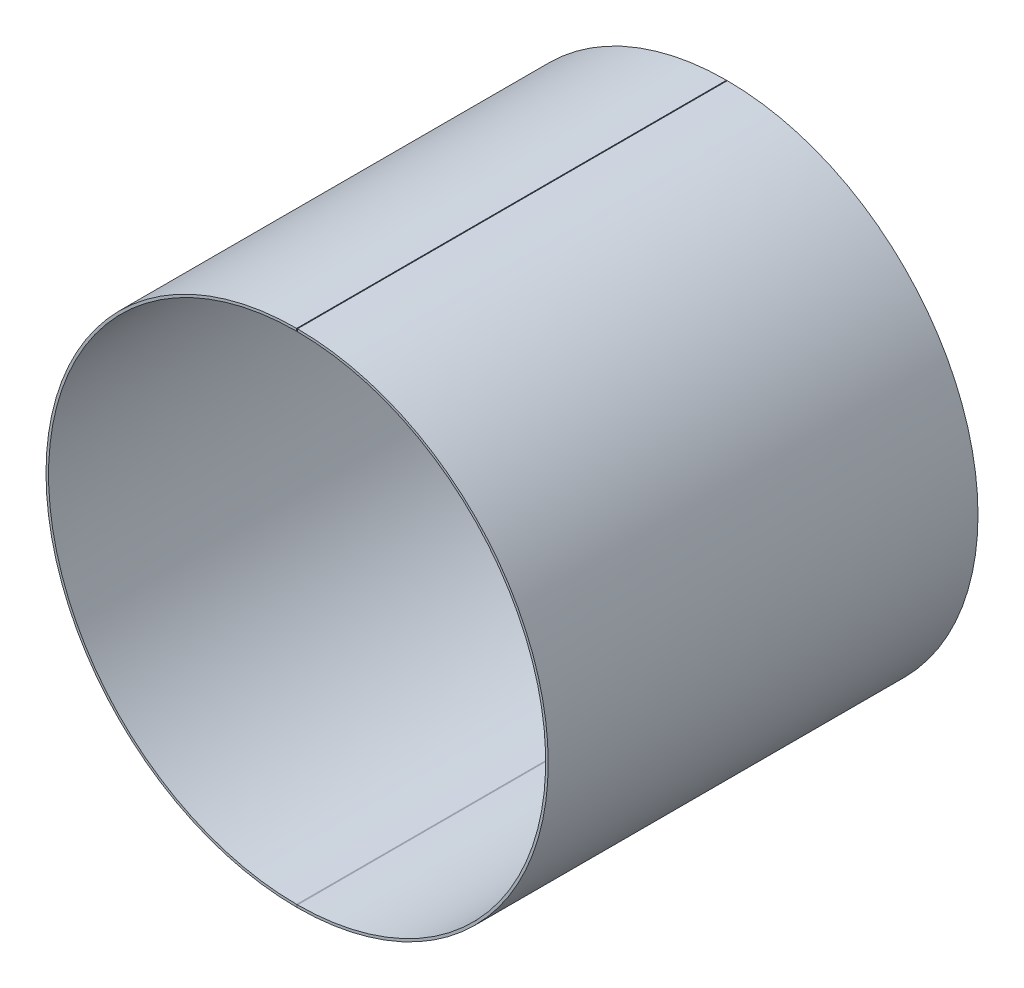
ISO-10303-21;
HEADER;
FILE_DESCRIPTION(('STEP AP214'),'2;1');
FILE_NAME('part.step','',(''),(''),'','','');
FILE_SCHEMA(('AUTOMOTIVE_DESIGN { 1 0 10303 214 1 1 1 1 }'));
ENDSEC;
DATA;
#1=APPLICATION_CONTEXT('core data for automotive mechanical design processes');
#2=APPLICATION_PROTOCOL_DEFINITION('international standard','automotive_design',2000,#1);
#3=PRODUCT_CONTEXT('',#1,'mechanical');
#4=PRODUCT('Part','Part','',(#3));
#5=PRODUCT_RELATED_PRODUCT_CATEGORY('part','',(#4));
#6=PRODUCT_DEFINITION_FORMATION('','',#4);
#7=PRODUCT_DEFINITION_CONTEXT('part definition',#1,'design');
#8=PRODUCT_DEFINITION('design','',#6,#7);
#9=PRODUCT_DEFINITION_SHAPE('','',#8);
#10=(LENGTH_UNIT() NAMED_UNIT(*) SI_UNIT(.MILLI.,.METRE.));
#11=(NAMED_UNIT(*) PLANE_ANGLE_UNIT() SI_UNIT($,.RADIAN.));
#12=(NAMED_UNIT(*) SI_UNIT($,.STERADIAN.) SOLID_ANGLE_UNIT());
#13=UNCERTAINTY_MEASURE_WITH_UNIT(LENGTH_MEASURE(1.E-05),#10,'distance_accuracy_value','');
#14=(GEOMETRIC_REPRESENTATION_CONTEXT(3) GLOBAL_UNCERTAINTY_ASSIGNED_CONTEXT((#13)) GLOBAL_UNIT_ASSIGNED_CONTEXT((#10,
#11,#12)) REPRESENTATION_CONTEXT('',''));
#15=CARTESIAN_POINT('',(0.,0.,0.));
#16=DIRECTION('',(0.,0.,1.));
#17=DIRECTION('',(1.,0.,0.));
#18=AXIS2_PLACEMENT_3D('',#15,#16,#17);
#19=CARTESIAN_POINT('',(0.254,-155.5748,266.7));
#20=DIRECTION('',(0.,0.,1.));
#21=DIRECTION('',(1.,0.,0.));
#22=AXIS2_PLACEMENT_3D('',#19,#20,#21);
#23=PLANE('',#22);
#24=DIRECTION('',(0.,1.,0.));
#25=VECTOR('',#24,1.);
#26=CARTESIAN_POINT('',(0.254,-155.5748,266.7));
#27=LINE('',#26,#25);
#28=CARTESIAN_POINT('',(0.254,-155.5748,266.7));
#29=VERTEX_POINT('',#28);
#30=CARTESIAN_POINT('',(0.254,-154.,266.7));
#31=VERTEX_POINT('',#30);
#32=EDGE_CURVE('E13',#29,#31,#27,.T.);
#33=ORIENTED_EDGE('',*,*,#32,.F.);
#34=CARTESIAN_POINT('',(0.254000000000028,0.,266.7));
#35=DIRECTION('',(0.,0.,1.));
#36=DIRECTION('',(1.,0.,0.));
#37=AXIS2_PLACEMENT_3D('',#34,#35,#36);
#38=CIRCLE('',#37,155.5748);
#39=CARTESIAN_POINT('',(0.254000000000038,155.5748,266.7));
#40=VERTEX_POINT('',#39);
#41=EDGE_CURVE('E140',#40,#29,#38,.F.);
#42=ORIENTED_EDGE('',*,*,#41,.F.);
#43=DIRECTION('',(0.,1.,0.));
#44=VECTOR('',#43,1.);
#45=CARTESIAN_POINT('',(0.254000000000038,154.,266.7));
#46=LINE('',#45,#44);
#47=CARTESIAN_POINT('',(0.254000000000038,154.,266.7));
#48=VERTEX_POINT('',#47);
#49=EDGE_CURVE('E122',#48,#40,#46,.T.);
#50=ORIENTED_EDGE('',*,*,#49,.F.);
#51=CARTESIAN_POINT('',(0.254000000000028,0.,266.7));
#52=DIRECTION('',(0.,0.,-1.));
#53=DIRECTION('',(1.,0.,0.));
#54=AXIS2_PLACEMENT_3D('',#51,#52,#53);
#55=CIRCLE('',#54,154.);
#56=EDGE_CURVE('E131',#48,#31,#55,.T.);
#57=ORIENTED_EDGE('',*,*,#56,.T.);
#58=EDGE_LOOP('',(#33,#42,#50,#57));
#59=FACE_BOUND('',#58,.T.);
#60=ADVANCED_FACE('F46',(#59),#23,.T.);
#61=CARTESIAN_POINT('',(0.254,-154.,0.));
#62=DIRECTION('',(0.,0.,-1.));
#63=DIRECTION('',(-1.,0.,0.));
#64=AXIS2_PLACEMENT_3D('',#61,#62,#63);
#65=PLANE('',#64);
#66=DIRECTION('',(0.,-1.,0.));
#67=VECTOR('',#66,1.);
#68=CARTESIAN_POINT('',(0.254,-154.,0.));
#69=LINE('',#68,#67);
#70=CARTESIAN_POINT('',(0.254,-154.,0.));
#71=VERTEX_POINT('',#70);
#72=CARTESIAN_POINT('',(0.254,-155.5748,0.));
#73=VERTEX_POINT('',#72);
#74=EDGE_CURVE('E54',#71,#73,#69,.T.);
#75=ORIENTED_EDGE('',*,*,#74,.F.);
#76=CARTESIAN_POINT('',(0.254000000000028,0.,0.));
#77=DIRECTION('',(0.,0.,-1.));
#78=DIRECTION('',(1.,0.,0.));
#79=AXIS2_PLACEMENT_3D('',#76,#77,#78);
#80=CIRCLE('',#79,154.);
#81=CARTESIAN_POINT('',(0.254000000000038,154.,0.));
#82=VERTEX_POINT('',#81);
#83=EDGE_CURVE('E162',#82,#71,#80,.T.);
#84=ORIENTED_EDGE('',*,*,#83,.F.);
#85=DIRECTION('',(0.,1.,0.));
#86=VECTOR('',#85,1.);
#87=CARTESIAN_POINT('',(0.254000000000038,154.,0.));
#88=LINE('',#87,#86);
#89=CARTESIAN_POINT('',(0.254000000000038,155.5748,0.));
#90=VERTEX_POINT('',#89);
#91=EDGE_CURVE('E124',#82,#90,#88,.T.);
#92=ORIENTED_EDGE('',*,*,#91,.T.);
#93=CARTESIAN_POINT('',(0.254000000000028,0.,0.));
#94=DIRECTION('',(0.,0.,1.));
#95=DIRECTION('',(1.,0.,0.));
#96=AXIS2_PLACEMENT_3D('',#93,#94,#95);
#97=CIRCLE('',#96,155.5748);
#98=EDGE_CURVE('E159',#90,#73,#97,.F.);
#99=ORIENTED_EDGE('',*,*,#98,.T.);
#100=EDGE_LOOP('',(#75,#84,#92,#99));
#101=FACE_BOUND('',#100,.T.);
#102=ADVANCED_FACE('F193',(#101),#65,.T.);
#103=CARTESIAN_POINT('',(-0.253999999999972,-154.,266.7));
#104=DIRECTION('',(0.,0.,1.));
#105=DIRECTION('',(1.,0.,0.));
#106=AXIS2_PLACEMENT_3D('',#103,#104,#105);
#107=PLANE('',#106);
#108=DIRECTION('',(0.,-1.,0.));
#109=VECTOR('',#108,1.);
#110=CARTESIAN_POINT('',(-0.253999999999972,-154.,266.7));
#111=LINE('',#110,#109);
#112=CARTESIAN_POINT('',(-0.253999999999972,-154.,266.7));
#113=VERTEX_POINT('',#112);
#114=CARTESIAN_POINT('',(-0.254000000000057,-155.5748,266.7));
#115=VERTEX_POINT('',#114);
#116=EDGE_CURVE('E62',#113,#115,#111,.T.);
#117=ORIENTED_EDGE('',*,*,#116,.F.);
#118=CARTESIAN_POINT('',(-0.254000000000028,0.,266.7));
#119=DIRECTION('',(0.,0.,-1.));
#120=DIRECTION('',(-1.,0.,0.));
#121=AXIS2_PLACEMENT_3D('',#118,#119,#120);
#122=CIRCLE('',#121,154.);
#123=CARTESIAN_POINT('',(-0.254000000000038,154.,266.7));
#124=VERTEX_POINT('',#123);
#125=EDGE_CURVE('E102',#113,#124,#122,.T.);
#126=ORIENTED_EDGE('',*,*,#125,.T.);
#127=DIRECTION('',(0.,-1.,0.));
#128=VECTOR('',#127,1.);
#129=CARTESIAN_POINT('',(-0.254000000000053,155.5748,266.7));
#130=LINE('',#129,#128);
#131=CARTESIAN_POINT('',(-0.254000000000053,155.5748,266.7));
#132=VERTEX_POINT('',#131);
#133=EDGE_CURVE('E201',#132,#124,#130,.T.);
#134=ORIENTED_EDGE('',*,*,#133,.F.);
#135=CARTESIAN_POINT('',(-0.254000000000028,0.,266.7));
#136=DIRECTION('',(0.,0.,1.));
#137=DIRECTION('',(1.,0.,0.));
#138=AXIS2_PLACEMENT_3D('',#135,#136,#137);
#139=CIRCLE('',#138,155.5748);
#140=EDGE_CURVE('E199',#115,#132,#139,.F.);
#141=ORIENTED_EDGE('',*,*,#140,.F.);
#142=EDGE_LOOP('',(#117,#126,#134,#141));
#143=FACE_BOUND('',#142,.T.);
#144=ADVANCED_FACE('F209',(#143),#107,.T.);
#145=CARTESIAN_POINT('',(-0.254000000000057,-155.5748,0.));
#146=DIRECTION('',(0.,0.,-1.));
#147=DIRECTION('',(-1.,0.,0.));
#148=AXIS2_PLACEMENT_3D('',#145,#146,#147);
#149=PLANE('',#148);
#150=DIRECTION('',(0.,1.,0.));
#151=VECTOR('',#150,1.);
#152=CARTESIAN_POINT('',(-0.254000000000057,-155.5748,0.));
#153=LINE('',#152,#151);
#154=CARTESIAN_POINT('',(-0.254000000000057,-155.5748,0.));
#155=VERTEX_POINT('',#154);
#156=CARTESIAN_POINT('',(-0.253999999999972,-154.,0.));
#157=VERTEX_POINT('',#156);
#158=EDGE_CURVE('E96',#155,#157,#153,.T.);
#159=ORIENTED_EDGE('',*,*,#158,.F.);
#160=CARTESIAN_POINT('',(-0.254000000000028,0.,0.));
#161=DIRECTION('',(0.,0.,1.));
#162=DIRECTION('',(1.,0.,0.));
#163=AXIS2_PLACEMENT_3D('',#160,#161,#162);
#164=CIRCLE('',#163,155.5748);
#165=CARTESIAN_POINT('',(-0.254000000000053,155.5748,0.));
#166=VERTEX_POINT('',#165);
#167=EDGE_CURVE('E154',#155,#166,#164,.F.);
#168=ORIENTED_EDGE('',*,*,#167,.T.);
#169=DIRECTION('',(0.,-1.,0.));
#170=VECTOR('',#169,1.);
#171=CARTESIAN_POINT('',(-0.254000000000053,155.5748,0.));
#172=LINE('',#171,#170);
#173=CARTESIAN_POINT('',(-0.254000000000038,154.,0.));
#174=VERTEX_POINT('',#173);
#175=EDGE_CURVE('E151',#166,#174,#172,.T.);
#176=ORIENTED_EDGE('',*,*,#175,.T.);
#177=CARTESIAN_POINT('',(-0.254000000000028,0.,0.));
#178=DIRECTION('',(0.,0.,-1.));
#179=DIRECTION('',(-1.,0.,0.));
#180=AXIS2_PLACEMENT_3D('',#177,#178,#179);
#181=CIRCLE('',#180,154.);
#182=EDGE_CURVE('E148',#157,#174,#181,.T.);
#183=ORIENTED_EDGE('',*,*,#182,.F.);
#184=EDGE_LOOP('',(#159,#168,#176,#183));
#185=FACE_BOUND('',#184,.T.);
#186=ADVANCED_FACE('F213',(#185),#149,.T.);
#187=CARTESIAN_POINT('',(-0.254000000000028,0.,266.7));
#188=DIRECTION('',(0.,0.,-1.));
#189=DIRECTION('',(-1.,0.,0.));
#190=AXIS2_PLACEMENT_3D('',#187,#188,#189);
#191=CYLINDRICAL_SURFACE('',#190,154.);
#192=ORIENTED_EDGE('',*,*,#182,.T.);
#193=DIRECTION('',(0.,0.,-1.));
#194=VECTOR('',#193,1.);
#195=CARTESIAN_POINT('',(-0.254000000000038,154.,266.7));
#196=LINE('',#195,#194);
#197=EDGE_CURVE('E178',#124,#174,#196,.T.);
#198=ORIENTED_EDGE('',*,*,#197,.F.);
#199=ORIENTED_EDGE('',*,*,#125,.F.);
#200=DIRECTION('',(0.,0.,-1.));
#201=VECTOR('',#200,1.);
#202=CARTESIAN_POINT('',(-0.253999999999972,-154.,266.7));
#203=LINE('',#202,#201);
#204=EDGE_CURVE('E147',#113,#157,#203,.T.);
#205=ORIENTED_EDGE('',*,*,#204,.T.);
#206=EDGE_LOOP('',(#192,#198,#199,#205));
#207=FACE_BOUND('',#206,.T.);
#208=ADVANCED_FACE('F216',(#207),#191,.F.);
#209=CARTESIAN_POINT('',(-0.254000000000053,155.5748,266.7));
#210=DIRECTION('',(1.,0.,0.));
#211=DIRECTION('',(0.,1.,0.));
#212=AXIS2_PLACEMENT_3D('',#209,#210,#211);
#213=PLANE('',#212);
#214=ORIENTED_EDGE('',*,*,#175,.F.);
#215=DIRECTION('',(0.,0.,-1.));
#216=VECTOR('',#215,1.);
#217=CARTESIAN_POINT('',(-0.254000000000053,155.5748,266.7));
#218=LINE('',#217,#216);
#219=EDGE_CURVE('E176',#132,#166,#218,.T.);
#220=ORIENTED_EDGE('',*,*,#219,.F.);
#221=ORIENTED_EDGE('',*,*,#133,.T.);
#222=ORIENTED_EDGE('',*,*,#197,.T.);
#223=EDGE_LOOP('',(#214,#220,#221,#222));
#224=FACE_BOUND('',#223,.T.);
#225=ADVANCED_FACE('F208',(#224),#213,.T.);
#226=CARTESIAN_POINT('',(-0.254000000000028,0.,266.7));
#227=DIRECTION('',(0.,0.,-1.));
#228=DIRECTION('',(-1.,0.,0.));
#229=AXIS2_PLACEMENT_3D('',#226,#227,#228);
#230=CYLINDRICAL_SURFACE('',#229,155.5748);
#231=ORIENTED_EDGE('',*,*,#167,.F.);
#232=DIRECTION('',(0.,0.,-1.));
#233=VECTOR('',#232,1.);
#234=CARTESIAN_POINT('',(-0.254000000000057,-155.5748,266.7));
#235=LINE('',#234,#233);
#236=EDGE_CURVE('E173',#115,#155,#235,.T.);
#237=ORIENTED_EDGE('',*,*,#236,.F.);
#238=ORIENTED_EDGE('',*,*,#140,.T.);
#239=ORIENTED_EDGE('',*,*,#219,.T.);
#240=EDGE_LOOP('',(#231,#237,#238,#239));
#241=FACE_BOUND('',#240,.T.);
#242=ADVANCED_FACE('F211',(#241),#230,.T.);
#243=CARTESIAN_POINT('',(-0.253999999999972,-155.5748,266.7));
#244=DIRECTION('',(0.,-1.,0.));
#245=DIRECTION('',(0.,0.,-1.));
#246=AXIS2_PLACEMENT_3D('',#243,#244,#245);
#247=PLANE('',#246);
#248=DIRECTION('',(1.,0.,0.));
#249=VECTOR('',#248,1.);
#250=CARTESIAN_POINT('',(-0.253999999999972,-155.5748,0.));
#251=LINE('',#250,#249);
#252=EDGE_CURVE('E157',#73,#155,#251,.F.);
#253=ORIENTED_EDGE('',*,*,#252,.F.);
#254=DIRECTION('',(0.,0.,-1.));
#255=VECTOR('',#254,1.);
#256=CARTESIAN_POINT('',(0.254,-155.5748,266.7));
#257=LINE('',#256,#255);
#258=EDGE_CURVE('E170',#29,#73,#257,.T.);
#259=ORIENTED_EDGE('',*,*,#258,.F.);
#260=DIRECTION('',(1.,0.,0.));
#261=VECTOR('',#260,1.);
#262=CARTESIAN_POINT('',(-0.253999999999972,-155.5748,266.7));
#263=LINE('',#262,#261);
#264=EDGE_CURVE('E142',#29,#115,#263,.F.);
#265=ORIENTED_EDGE('',*,*,#264,.T.);
#266=ORIENTED_EDGE('',*,*,#236,.T.);
#267=EDGE_LOOP('',(#253,#259,#265,#266));
#268=FACE_BOUND('',#267,.T.);
#269=ADVANCED_FACE('F190',(#268),#247,.T.);
#270=CARTESIAN_POINT('',(0.254000000000028,0.,266.7));
#271=DIRECTION('',(0.,0.,-1.));
#272=DIRECTION('',(-1.,0.,0.));
#273=AXIS2_PLACEMENT_3D('',#270,#271,#272);
#274=CYLINDRICAL_SURFACE('',#273,155.5748);
#275=ORIENTED_EDGE('',*,*,#98,.F.);
#276=DIRECTION('',(0.,0.,-1.));
#277=VECTOR('',#276,1.);
#278=CARTESIAN_POINT('',(0.254000000000038,155.5748,266.7));
#279=LINE('',#278,#277);
#280=EDGE_CURVE('E126',#40,#90,#279,.T.);
#281=ORIENTED_EDGE('',*,*,#280,.F.);
#282=ORIENTED_EDGE('',*,*,#41,.T.);
#283=ORIENTED_EDGE('',*,*,#258,.T.);
#284=EDGE_LOOP('',(#275,#281,#282,#283));
#285=FACE_BOUND('',#284,.T.);
#286=ADVANCED_FACE('F186',(#285),#274,.T.);
#287=CARTESIAN_POINT('',(0.254000000000038,154.,266.7));
#288=DIRECTION('',(-1.,0.,0.));
#289=DIRECTION('',(0.,-1.,0.));
#290=AXIS2_PLACEMENT_3D('',#287,#288,#289);
#291=PLANE('',#290);
#292=ORIENTED_EDGE('',*,*,#91,.F.);
#293=DIRECTION('',(0.,0.,-1.));
#294=VECTOR('',#293,1.);
#295=CARTESIAN_POINT('',(0.254000000000038,154.,266.7));
#296=LINE('',#295,#294);
#297=EDGE_CURVE('E118',#48,#82,#296,.T.);
#298=ORIENTED_EDGE('',*,*,#297,.F.);
#299=ORIENTED_EDGE('',*,*,#49,.T.);
#300=ORIENTED_EDGE('',*,*,#280,.T.);
#301=EDGE_LOOP('',(#292,#298,#299,#300));
#302=FACE_BOUND('',#301,.T.);
#303=ADVANCED_FACE('F120',(#302),#291,.T.);
#304=CARTESIAN_POINT('',(0.254000000000028,0.,266.7));
#305=DIRECTION('',(0.,0.,-1.));
#306=DIRECTION('',(-1.,0.,0.));
#307=AXIS2_PLACEMENT_3D('',#304,#305,#306);
#308=CYLINDRICAL_SURFACE('',#307,154.);
#309=ORIENTED_EDGE('',*,*,#83,.T.);
#310=DIRECTION('',(0.,0.,-1.));
#311=VECTOR('',#310,1.);
#312=CARTESIAN_POINT('',(0.254,-154.,266.7));
#313=LINE('',#312,#311);
#314=EDGE_CURVE('E127',#31,#71,#313,.T.);
#315=ORIENTED_EDGE('',*,*,#314,.F.);
#316=ORIENTED_EDGE('',*,*,#56,.F.);
#317=ORIENTED_EDGE('',*,*,#297,.T.);
#318=EDGE_LOOP('',(#309,#315,#316,#317));
#319=FACE_BOUND('',#318,.T.);
#320=ADVANCED_FACE('F132',(#319),#308,.F.);
#321=CARTESIAN_POINT('',(-0.253999999999972,-154.,266.7));
#322=DIRECTION('',(0.,-1.,0.));
#323=DIRECTION('',(0.,0.,-1.));
#324=AXIS2_PLACEMENT_3D('',#321,#322,#323);
#325=PLANE('',#324);
#326=DIRECTION('',(-1.,0.,0.));
#327=VECTOR('',#326,1.);
#328=CARTESIAN_POINT('',(-0.253999999999972,-154.,0.));
#329=LINE('',#328,#327);
#330=EDGE_CURVE('E164',#71,#157,#329,.T.);
#331=ORIENTED_EDGE('',*,*,#330,.T.);
#332=ORIENTED_EDGE('',*,*,#204,.F.);
#333=DIRECTION('',(-1.,0.,0.));
#334=VECTOR('',#333,1.);
#335=CARTESIAN_POINT('',(-0.253999999999972,-154.,266.7));
#336=LINE('',#335,#334);
#337=EDGE_CURVE('E136',#31,#113,#336,.T.);
#338=ORIENTED_EDGE('',*,*,#337,.F.);
#339=ORIENTED_EDGE('',*,*,#314,.T.);
#340=EDGE_LOOP('',(#331,#332,#338,#339));
#341=FACE_BOUND('',#340,.T.);
#342=ADVANCED_FACE('F195',(#341),#325,.F.);
#343=CARTESIAN_POINT('',(-0.254000000000028,0.,266.7));
#344=DIRECTION('',(0.,0.,-1.));
#345=DIRECTION('',(-1.,0.,0.));
#346=AXIS2_PLACEMENT_3D('',#343,#344,#345);
#347=PLANE('',#346);
#348=ORIENTED_EDGE('',*,*,#337,.T.);
#349=ORIENTED_EDGE('',*,*,#116,.T.);
#350=ORIENTED_EDGE('',*,*,#264,.F.);
#351=ORIENTED_EDGE('',*,*,#32,.T.);
#352=EDGE_LOOP('',(#348,#349,#350,#351));
#353=FACE_BOUND('',#352,.T.);
#354=ADVANCED_FACE('F198',(#353),#347,.F.);
#355=CARTESIAN_POINT('',(-0.254000000000028,0.,0.));
#356=DIRECTION('',(0.,0.,-1.));
#357=DIRECTION('',(-1.,0.,0.));
#358=AXIS2_PLACEMENT_3D('',#355,#356,#357);
#359=PLANE('',#358);
#360=ORIENTED_EDGE('',*,*,#252,.T.);
#361=ORIENTED_EDGE('',*,*,#158,.T.);
#362=ORIENTED_EDGE('',*,*,#330,.F.);
#363=ORIENTED_EDGE('',*,*,#74,.T.);
#364=EDGE_LOOP('',(#360,#361,#362,#363));
#365=FACE_BOUND('',#364,.T.);
#366=ADVANCED_FACE('F181',(#365),#359,.T.);
#367=CLOSED_SHELL('',(#60,#102,#144,#186,#208,#225,#242,#269,#286,#303,#320,#342,#354,#366));
#368=MANIFOLD_SOLID_BREP('B2',#367);
#369=ADVANCED_BREP_SHAPE_REPRESENTATION('',(#18,#368),#14);
#370=SHAPE_DEFINITION_REPRESENTATION(#9,#369);
ENDSEC;
END-ISO-10303-21;
